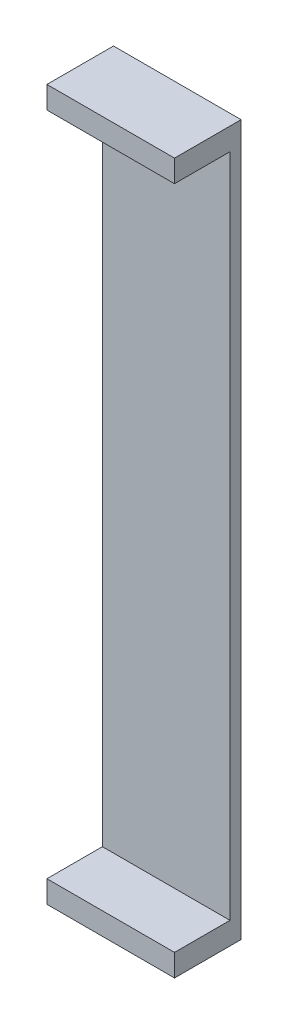
ISO-10303-21;
HEADER;
FILE_DESCRIPTION(('STEP AP214'),'2;1');
FILE_NAME('part.step','',(''),(''),'','','');
FILE_SCHEMA(('AUTOMOTIVE_DESIGN { 1 0 10303 214 1 1 1 1 }'));
ENDSEC;
DATA;
#1=APPLICATION_CONTEXT('core data for automotive mechanical design processes');
#2=APPLICATION_PROTOCOL_DEFINITION('international standard','automotive_design',2000,#1);
#3=PRODUCT_CONTEXT('',#1,'mechanical');
#4=PRODUCT('Part','Part','',(#3));
#5=PRODUCT_RELATED_PRODUCT_CATEGORY('part','',(#4));
#6=PRODUCT_DEFINITION_FORMATION('','',#4);
#7=PRODUCT_DEFINITION_CONTEXT('part definition',#1,'design');
#8=PRODUCT_DEFINITION('design','',#6,#7);
#9=PRODUCT_DEFINITION_SHAPE('','',#8);
#10=(LENGTH_UNIT() NAMED_UNIT(*) SI_UNIT(.MILLI.,.METRE.));
#11=(NAMED_UNIT(*) PLANE_ANGLE_UNIT() SI_UNIT($,.RADIAN.));
#12=(NAMED_UNIT(*) SI_UNIT($,.STERADIAN.) SOLID_ANGLE_UNIT());
#13=UNCERTAINTY_MEASURE_WITH_UNIT(LENGTH_MEASURE(1.E-05),#10,'distance_accuracy_value','');
#14=(GEOMETRIC_REPRESENTATION_CONTEXT(3) GLOBAL_UNCERTAINTY_ASSIGNED_CONTEXT((#13)) GLOBAL_UNIT_ASSIGNED_CONTEXT((#10,
#11,#12)) REPRESENTATION_CONTEXT('',''));
#15=CARTESIAN_POINT('',(0.,0.,0.));
#16=DIRECTION('',(0.,0.,1.));
#17=DIRECTION('',(1.,0.,0.));
#18=AXIS2_PLACEMENT_3D('',#15,#16,#17);
#19=CARTESIAN_POINT('',(0.,0.,2.));
#20=DIRECTION('',(0.,0.,-1.));
#21=DIRECTION('',(-1.,0.,0.));
#22=AXIS2_PLACEMENT_3D('',#19,#20,#21);
#23=PLANE('',#22);
#24=DIRECTION('',(-1.,0.,0.));
#25=VECTOR('',#24,1.);
#26=CARTESIAN_POINT('',(23.6259067357513,4.76113890449732,2.));
#27=LINE('',#26,#25);
#28=CARTESIAN_POINT('',(23.6259067357513,4.76113890449732,2.));
#29=VERTEX_POINT('',#28);
#30=CARTESIAN_POINT('',(0.625906735751332,4.76113890449732,2.));
#31=VERTEX_POINT('',#30);
#32=EDGE_CURVE('E116',#29,#31,#27,.T.);
#33=ORIENTED_EDGE('',*,*,#32,.F.);
#34=DIRECTION('',(0.,1.,0.));
#35=VECTOR('',#34,1.);
#36=CARTESIAN_POINT('',(23.6259067357513,0.76113890449732,2.));
#37=LINE('',#36,#35);
#38=CARTESIAN_POINT('',(23.6259067357513,124.761138904497,2.));
#39=VERTEX_POINT('',#38);
#40=EDGE_CURVE('E120',#29,#39,#37,.T.);
#41=ORIENTED_EDGE('',*,*,#40,.T.);
#42=DIRECTION('',(1.,0.,0.));
#43=VECTOR('',#42,1.);
#44=CARTESIAN_POINT('',(23.6259067357513,124.761138904497,2.));
#45=LINE('',#44,#43);
#46=CARTESIAN_POINT('',(0.625906735751332,124.761138904497,2.));
#47=VERTEX_POINT('',#46);
#48=EDGE_CURVE('E52',#47,#39,#45,.T.);
#49=ORIENTED_EDGE('',*,*,#48,.F.);
#50=DIRECTION('',(0.,-1.,0.));
#51=VECTOR('',#50,1.);
#52=CARTESIAN_POINT('',(0.625906735751332,0.76113890449732,2.));
#53=LINE('',#52,#51);
#54=EDGE_CURVE('E47',#47,#31,#53,.T.);
#55=ORIENTED_EDGE('',*,*,#54,.T.);
#56=EDGE_LOOP('',(#33,#41,#49,#55));
#57=FACE_BOUND('',#56,.T.);
#58=ADVANCED_FACE('F32',(#57),#23,.F.);
#59=CARTESIAN_POINT('',(0.625906735751332,0.76113890449732,2.));
#60=DIRECTION('',(1.,0.,0.));
#61=DIRECTION('',(0.,0.,-1.));
#62=AXIS2_PLACEMENT_3D('',#59,#60,#61);
#63=PLANE('',#62);
#64=DIRECTION('',(0.,-1.,0.));
#65=VECTOR('',#64,1.);
#66=CARTESIAN_POINT('',(0.625906735751332,0.76113890449732,0.));
#67=LINE('',#66,#65);
#68=CARTESIAN_POINT('',(0.625906735751332,128.761138904497,0.));
#69=VERTEX_POINT('',#68);
#70=CARTESIAN_POINT('',(0.625906735751332,0.76113890449732,0.));
#71=VERTEX_POINT('',#70);
#72=EDGE_CURVE('E141',#69,#71,#67,.T.);
#73=ORIENTED_EDGE('',*,*,#72,.T.);
#74=DIRECTION('',(0.,0.,-1.));
#75=VECTOR('',#74,1.);
#76=CARTESIAN_POINT('',(0.625906735751332,0.76113890449732,2.));
#77=LINE('',#76,#75);
#78=CARTESIAN_POINT('',(0.625906735751332,0.761138904497316,12.));
#79=VERTEX_POINT('',#78);
#80=EDGE_CURVE('E11',#79,#71,#77,.T.);
#81=ORIENTED_EDGE('',*,*,#80,.F.);
#82=DIRECTION('',(0.,-1.,0.));
#83=VECTOR('',#82,1.);
#84=CARTESIAN_POINT('',(0.625906735751332,4.76113890449732,12.));
#85=LINE('',#84,#83);
#86=CARTESIAN_POINT('',(0.625906735751332,4.76113890449732,12.));
#87=VERTEX_POINT('',#86);
#88=EDGE_CURVE('E106',#87,#79,#85,.T.);
#89=ORIENTED_EDGE('',*,*,#88,.F.);
#90=DIRECTION('',(0.,0.,-1.));
#91=VECTOR('',#90,1.);
#92=CARTESIAN_POINT('',(0.625906735751332,4.76113890449732,12.));
#93=LINE('',#92,#91);
#94=EDGE_CURVE('E102',#87,#31,#93,.T.);
#95=ORIENTED_EDGE('',*,*,#94,.T.);
#96=ORIENTED_EDGE('',*,*,#54,.F.);
#97=DIRECTION('',(0.,0.,-1.));
#98=VECTOR('',#97,1.);
#99=CARTESIAN_POINT('',(0.62590673575133,124.761138904497,12.));
#100=LINE('',#99,#98);
#101=CARTESIAN_POINT('',(0.62590673575133,124.761138904497,12.));
#102=VERTEX_POINT('',#101);
#103=EDGE_CURVE('E138',#102,#47,#100,.T.);
#104=ORIENTED_EDGE('',*,*,#103,.F.);
#105=DIRECTION('',(0.,-1.,0.));
#106=VECTOR('',#105,1.);
#107=CARTESIAN_POINT('',(0.62590673575133,128.761138904497,12.));
#108=LINE('',#107,#106);
#109=CARTESIAN_POINT('',(0.62590673575133,128.761138904497,12.));
#110=VERTEX_POINT('',#109);
#111=EDGE_CURVE('E132',#110,#102,#108,.T.);
#112=ORIENTED_EDGE('',*,*,#111,.F.);
#113=DIRECTION('',(0.,0.,-1.));
#114=VECTOR('',#113,1.);
#115=CARTESIAN_POINT('',(0.625906735751332,128.761138904497,2.));
#116=LINE('',#115,#114);
#117=EDGE_CURVE('E145',#110,#69,#116,.T.);
#118=ORIENTED_EDGE('',*,*,#117,.T.);
#119=EDGE_LOOP('',(#73,#81,#89,#95,#96,#104,#112,#118));
#120=FACE_BOUND('',#119,.T.);
#121=ADVANCED_FACE('F34',(#120),#63,.F.);
#122=CARTESIAN_POINT('',(0.625906735751332,0.76113890449732,2.));
#123=DIRECTION('',(0.,1.,0.));
#124=DIRECTION('',(0.,0.,1.));
#125=AXIS2_PLACEMENT_3D('',#122,#123,#124);
#126=PLANE('',#125);
#127=DIRECTION('',(1.,0.,0.));
#128=VECTOR('',#127,1.);
#129=CARTESIAN_POINT('',(0.625906735751332,0.76113890449732,0.));
#130=LINE('',#129,#128);
#131=CARTESIAN_POINT('',(23.6259067357513,0.76113890449732,0.));
#132=VERTEX_POINT('',#131);
#133=EDGE_CURVE('E148',#71,#132,#130,.T.);
#134=ORIENTED_EDGE('',*,*,#133,.T.);
#135=DIRECTION('',(0.,0.,-1.));
#136=VECTOR('',#135,1.);
#137=CARTESIAN_POINT('',(23.6259067357513,0.76113890449732,2.));
#138=LINE('',#137,#136);
#139=CARTESIAN_POINT('',(23.6259067357513,0.761138904497319,12.));
#140=VERTEX_POINT('',#139);
#141=EDGE_CURVE('E40',#140,#132,#138,.T.);
#142=ORIENTED_EDGE('',*,*,#141,.F.);
#143=DIRECTION('',(1.,0.,0.));
#144=VECTOR('',#143,1.);
#145=CARTESIAN_POINT('',(23.6259067357513,0.761138904497319,12.));
#146=LINE('',#145,#144);
#147=EDGE_CURVE('E113',#79,#140,#146,.T.);
#148=ORIENTED_EDGE('',*,*,#147,.F.);
#149=ORIENTED_EDGE('',*,*,#80,.T.);
#150=EDGE_LOOP('',(#134,#142,#148,#149));
#151=FACE_BOUND('',#150,.T.);
#152=ADVANCED_FACE('F189',(#151),#126,.F.);
#153=CARTESIAN_POINT('',(23.6259067357513,0.76113890449732,2.));
#154=DIRECTION('',(-1.,0.,0.));
#155=DIRECTION('',(0.,0.,1.));
#156=AXIS2_PLACEMENT_3D('',#153,#154,#155);
#157=PLANE('',#156);
#158=DIRECTION('',(0.,1.,0.));
#159=VECTOR('',#158,1.);
#160=CARTESIAN_POINT('',(23.6259067357513,0.76113890449732,0.));
#161=LINE('',#160,#159);
#162=CARTESIAN_POINT('',(23.6259067357513,128.761138904497,0.));
#163=VERTEX_POINT('',#162);
#164=EDGE_CURVE('E150',#132,#163,#161,.T.);
#165=ORIENTED_EDGE('',*,*,#164,.T.);
#166=DIRECTION('',(0.,0.,-1.));
#167=VECTOR('',#166,1.);
#168=CARTESIAN_POINT('',(23.6259067357513,128.761138904497,2.));
#169=LINE('',#168,#167);
#170=CARTESIAN_POINT('',(23.6259067357513,128.761138904497,12.));
#171=VERTEX_POINT('',#170);
#172=EDGE_CURVE('E155',#171,#163,#169,.T.);
#173=ORIENTED_EDGE('',*,*,#172,.F.);
#174=DIRECTION('',(0.,1.,0.));
#175=VECTOR('',#174,1.);
#176=CARTESIAN_POINT('',(23.6259067357513,128.761138904497,12.));
#177=LINE('',#176,#175);
#178=CARTESIAN_POINT('',(23.6259067357513,124.761138904497,12.));
#179=VERTEX_POINT('',#178);
#180=EDGE_CURVE('E122',#179,#171,#177,.T.);
#181=ORIENTED_EDGE('',*,*,#180,.F.);
#182=DIRECTION('',(0.,0.,-1.));
#183=VECTOR('',#182,1.);
#184=CARTESIAN_POINT('',(23.6259067357513,124.761138904497,12.));
#185=LINE('',#184,#183);
#186=EDGE_CURVE('E135',#179,#39,#185,.T.);
#187=ORIENTED_EDGE('',*,*,#186,.T.);
#188=ORIENTED_EDGE('',*,*,#40,.F.);
#189=DIRECTION('',(0.,0.,-1.));
#190=VECTOR('',#189,1.);
#191=CARTESIAN_POINT('',(23.6259067357513,4.76113890449732,12.));
#192=LINE('',#191,#190);
#193=CARTESIAN_POINT('',(23.6259067357513,4.76113890449732,12.));
#194=VERTEX_POINT('',#193);
#195=EDGE_CURVE('E100',#194,#29,#192,.T.);
#196=ORIENTED_EDGE('',*,*,#195,.F.);
#197=DIRECTION('',(0.,1.,0.));
#198=VECTOR('',#197,1.);
#199=CARTESIAN_POINT('',(23.6259067357513,4.76113890449732,12.));
#200=LINE('',#199,#198);
#201=EDGE_CURVE('E107',#140,#194,#200,.T.);
#202=ORIENTED_EDGE('',*,*,#201,.F.);
#203=ORIENTED_EDGE('',*,*,#141,.T.);
#204=EDGE_LOOP('',(#165,#173,#181,#187,#188,#196,#202,#203));
#205=FACE_BOUND('',#204,.T.);
#206=ADVANCED_FACE('F118',(#205),#157,.F.);
#207=CARTESIAN_POINT('',(0.625906735751332,128.761138904497,2.));
#208=DIRECTION('',(0.,-1.,0.));
#209=DIRECTION('',(0.,0.,-1.));
#210=AXIS2_PLACEMENT_3D('',#207,#208,#209);
#211=PLANE('',#210);
#212=DIRECTION('',(-1.,0.,0.));
#213=VECTOR('',#212,1.);
#214=CARTESIAN_POINT('',(0.625906735751332,128.761138904497,0.));
#215=LINE('',#214,#213);
#216=EDGE_CURVE('E143',#163,#69,#215,.T.);
#217=ORIENTED_EDGE('',*,*,#216,.T.);
#218=ORIENTED_EDGE('',*,*,#117,.F.);
#219=DIRECTION('',(-1.,0.,0.));
#220=VECTOR('',#219,1.);
#221=CARTESIAN_POINT('',(23.6259067357513,128.761138904497,12.));
#222=LINE('',#221,#220);
#223=EDGE_CURVE('E129',#171,#110,#222,.T.);
#224=ORIENTED_EDGE('',*,*,#223,.F.);
#225=ORIENTED_EDGE('',*,*,#172,.T.);
#226=EDGE_LOOP('',(#217,#218,#224,#225));
#227=FACE_BOUND('',#226,.T.);
#228=ADVANCED_FACE('F164',(#227),#211,.F.);
#229=CARTESIAN_POINT('',(0.,0.,0.));
#230=DIRECTION('',(0.,0.,-1.));
#231=DIRECTION('',(-1.,0.,0.));
#232=AXIS2_PLACEMENT_3D('',#229,#230,#231);
#233=PLANE('',#232);
#234=ORIENTED_EDGE('',*,*,#72,.F.);
#235=ORIENTED_EDGE('',*,*,#216,.F.);
#236=ORIENTED_EDGE('',*,*,#164,.F.);
#237=ORIENTED_EDGE('',*,*,#133,.F.);
#238=EDGE_LOOP('',(#234,#235,#236,#237));
#239=FACE_BOUND('',#238,.T.);
#240=ADVANCED_FACE('F162',(#239),#233,.T.);
#241=CARTESIAN_POINT('',(23.6259067357513,124.761138904497,12.));
#242=DIRECTION('',(0.,1.,0.));
#243=DIRECTION('',(0.,0.,1.));
#244=AXIS2_PLACEMENT_3D('',#241,#242,#243);
#245=PLANE('',#244);
#246=ORIENTED_EDGE('',*,*,#48,.T.);
#247=ORIENTED_EDGE('',*,*,#186,.F.);
#248=DIRECTION('',(1.,0.,0.));
#249=VECTOR('',#248,1.);
#250=CARTESIAN_POINT('',(23.6259067357513,124.761138904497,12.));
#251=LINE('',#250,#249);
#252=EDGE_CURVE('E134',#102,#179,#251,.T.);
#253=ORIENTED_EDGE('',*,*,#252,.F.);
#254=ORIENTED_EDGE('',*,*,#103,.T.);
#255=EDGE_LOOP('',(#246,#247,#253,#254));
#256=FACE_BOUND('',#255,.T.);
#257=ADVANCED_FACE('F175',(#256),#245,.F.);
#258=CARTESIAN_POINT('',(0.,0.,12.));
#259=DIRECTION('',(0.,0.,-1.));
#260=DIRECTION('',(-1.,0.,0.));
#261=AXIS2_PLACEMENT_3D('',#258,#259,#260);
#262=PLANE('',#261);
#263=ORIENTED_EDGE('',*,*,#180,.T.);
#264=ORIENTED_EDGE('',*,*,#223,.T.);
#265=ORIENTED_EDGE('',*,*,#111,.T.);
#266=ORIENTED_EDGE('',*,*,#252,.T.);
#267=EDGE_LOOP('',(#263,#264,#265,#266));
#268=FACE_BOUND('',#267,.T.);
#269=ADVANCED_FACE('F171',(#268),#262,.F.);
#270=CARTESIAN_POINT('',(23.6259067357513,4.76113890449732,12.));
#271=DIRECTION('',(0.,-1.,0.));
#272=DIRECTION('',(1.,0.,0.));
#273=AXIS2_PLACEMENT_3D('',#270,#271,#272);
#274=PLANE('',#273);
#275=ORIENTED_EDGE('',*,*,#32,.T.);
#276=ORIENTED_EDGE('',*,*,#94,.F.);
#277=DIRECTION('',(-1.,0.,0.));
#278=VECTOR('',#277,1.);
#279=CARTESIAN_POINT('',(23.6259067357513,4.76113890449732,12.));
#280=LINE('',#279,#278);
#281=EDGE_CURVE('E96',#194,#87,#280,.T.);
#282=ORIENTED_EDGE('',*,*,#281,.F.);
#283=ORIENTED_EDGE('',*,*,#195,.T.);
#284=EDGE_LOOP('',(#275,#276,#282,#283));
#285=FACE_BOUND('',#284,.T.);
#286=ADVANCED_FACE('F98',(#285),#274,.F.);
#287=CARTESIAN_POINT('',(0.,0.,12.));
#288=DIRECTION('',(0.,0.,-1.));
#289=DIRECTION('',(-1.,0.,0.));
#290=AXIS2_PLACEMENT_3D('',#287,#288,#289);
#291=PLANE('',#290);
#292=ORIENTED_EDGE('',*,*,#201,.T.);
#293=ORIENTED_EDGE('',*,*,#281,.T.);
#294=ORIENTED_EDGE('',*,*,#88,.T.);
#295=ORIENTED_EDGE('',*,*,#147,.T.);
#296=EDGE_LOOP('',(#292,#293,#294,#295));
#297=FACE_BOUND('',#296,.T.);
#298=ADVANCED_FACE('F111',(#297),#291,.F.);
#299=CLOSED_SHELL('',(#58,#121,#152,#206,#228,#240,#257,#269,#286,#298));
#300=MANIFOLD_SOLID_BREP('B2',#299);
#301=ADVANCED_BREP_SHAPE_REPRESENTATION('',(#18,#300),#14);
#302=SHAPE_DEFINITION_REPRESENTATION(#9,#301);
ENDSEC;
END-ISO-10303-21;
